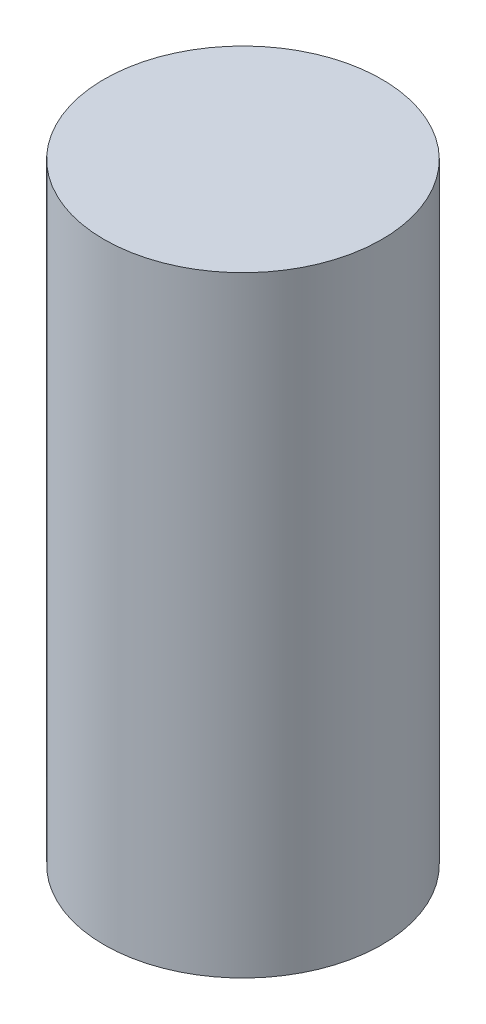
ISO-10303-21;
HEADER;
FILE_DESCRIPTION(('STEP AP214'),'2;1');
FILE_NAME('part.step','',(''),(''),'','','');
FILE_SCHEMA(('AUTOMOTIVE_DESIGN { 1 0 10303 214 1 1 1 1 }'));
ENDSEC;
DATA;
#1=APPLICATION_CONTEXT('core data for automotive mechanical design processes');
#2=APPLICATION_PROTOCOL_DEFINITION('international standard','automotive_design',2000,#1);
#3=PRODUCT_CONTEXT('',#1,'mechanical');
#4=PRODUCT('Part','Part','',(#3));
#5=PRODUCT_RELATED_PRODUCT_CATEGORY('part','',(#4));
#6=PRODUCT_DEFINITION_FORMATION('','',#4);
#7=PRODUCT_DEFINITION_CONTEXT('part definition',#1,'design');
#8=PRODUCT_DEFINITION('design','',#6,#7);
#9=PRODUCT_DEFINITION_SHAPE('','',#8);
#10=(LENGTH_UNIT() NAMED_UNIT(*) SI_UNIT(.MILLI.,.METRE.));
#11=(NAMED_UNIT(*) PLANE_ANGLE_UNIT() SI_UNIT($,.RADIAN.));
#12=(NAMED_UNIT(*) SI_UNIT($,.STERADIAN.) SOLID_ANGLE_UNIT());
#13=UNCERTAINTY_MEASURE_WITH_UNIT(LENGTH_MEASURE(1.E-05),#10,'distance_accuracy_value','');
#14=(GEOMETRIC_REPRESENTATION_CONTEXT(3) GLOBAL_UNCERTAINTY_ASSIGNED_CONTEXT((#13)) GLOBAL_UNIT_ASSIGNED_CONTEXT((#10,
#11,#12)) REPRESENTATION_CONTEXT('',''));
#15=CARTESIAN_POINT('',(0.,0.,0.));
#16=DIRECTION('',(0.,0.,1.));
#17=DIRECTION('',(1.,0.,0.));
#18=AXIS2_PLACEMENT_3D('',#15,#16,#17);
#19=CARTESIAN_POINT('',(0.,11.,0.));
#20=DIRECTION('',(0.,-1.,0.));
#21=DIRECTION('',(0.,0.,-1.));
#22=AXIS2_PLACEMENT_3D('',#19,#20,#21);
#23=CYLINDRICAL_SURFACE('',#22,5.);
#24=CARTESIAN_POINT('',(0.,11.,0.));
#25=DIRECTION('',(0.,1.,0.));
#26=DIRECTION('',(0.,0.,1.));
#27=AXIS2_PLACEMENT_3D('',#24,#25,#26);
#28=CIRCLE('',#27,5.);
#29=CARTESIAN_POINT('',(0.,11.,5.));
#30=VERTEX_POINT('',#29);
#31=EDGE_CURVE('E10',#30,#30,#28,.T.);
#32=ORIENTED_EDGE('',*,*,#31,.F.);
#33=EDGE_LOOP('',(#32));
#34=FACE_BOUND('',#33,.T.);
#35=CARTESIAN_POINT('',(0.,-11.,0.));
#36=DIRECTION('',(0.,1.,0.));
#37=DIRECTION('',(0.,0.,1.));
#38=AXIS2_PLACEMENT_3D('',#35,#36,#37);
#39=CIRCLE('',#38,5.);
#40=CARTESIAN_POINT('',(0.,-11.,5.));
#41=VERTEX_POINT('',#40);
#42=EDGE_CURVE('E46',#41,#41,#39,.T.);
#43=ORIENTED_EDGE('',*,*,#42,.T.);
#44=EDGE_LOOP('',(#43));
#45=FACE_BOUND('',#44,.T.);
#46=ADVANCED_FACE('F43',(#34,#45),#23,.T.);
#47=CARTESIAN_POINT('',(0.,11.,0.));
#48=DIRECTION('',(0.,1.,0.));
#49=DIRECTION('',(0.,0.,1.));
#50=AXIS2_PLACEMENT_3D('',#47,#48,#49);
#51=PLANE('',#50);
#52=ORIENTED_EDGE('',*,*,#31,.T.);
#53=EDGE_LOOP('',(#52));
#54=FACE_BOUND('',#53,.T.);
#55=ADVANCED_FACE('F60',(#54),#51,.T.);
#56=CARTESIAN_POINT('',(0.,-11.,0.));
#57=DIRECTION('',(0.,1.,0.));
#58=DIRECTION('',(0.,0.,1.));
#59=AXIS2_PLACEMENT_3D('',#56,#57,#58);
#60=PLANE('',#59);
#61=ORIENTED_EDGE('',*,*,#42,.F.);
#62=EDGE_LOOP('',(#61));
#63=FACE_BOUND('',#62,.T.);
#64=ADVANCED_FACE('F58',(#63),#60,.F.);
#65=CLOSED_SHELL('',(#46,#55,#64));
#66=MANIFOLD_SOLID_BREP('B2',#65);
#67=ADVANCED_BREP_SHAPE_REPRESENTATION('',(#18,#66),#14);
#68=SHAPE_DEFINITION_REPRESENTATION(#9,#67);
ENDSEC;
END-ISO-10303-21;
